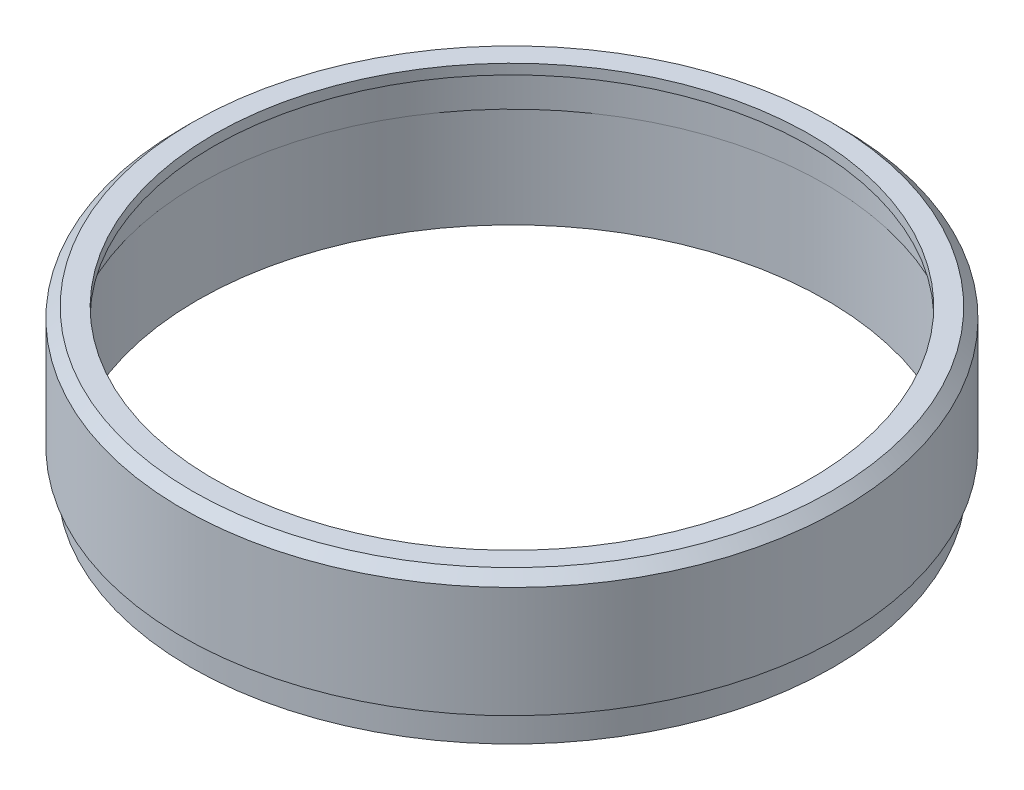
ISO-10303-21;
HEADER;
FILE_DESCRIPTION(('STEP AP214'),'2;1');
FILE_NAME('part.step','',(''),(''),'','','');
FILE_SCHEMA(('AUTOMOTIVE_DESIGN { 1 0 10303 214 1 1 1 1 }'));
ENDSEC;
DATA;
#1=APPLICATION_CONTEXT('core data for automotive mechanical design processes');
#2=APPLICATION_PROTOCOL_DEFINITION('international standard','automotive_design',2000,#1);
#3=PRODUCT_CONTEXT('',#1,'mechanical');
#4=PRODUCT('Part','Part','',(#3));
#5=PRODUCT_RELATED_PRODUCT_CATEGORY('part','',(#4));
#6=PRODUCT_DEFINITION_FORMATION('','',#4);
#7=PRODUCT_DEFINITION_CONTEXT('part definition',#1,'design');
#8=PRODUCT_DEFINITION('design','',#6,#7);
#9=PRODUCT_DEFINITION_SHAPE('','',#8);
#10=(LENGTH_UNIT() NAMED_UNIT(*) SI_UNIT(.MILLI.,.METRE.));
#11=(NAMED_UNIT(*) PLANE_ANGLE_UNIT() SI_UNIT($,.RADIAN.));
#12=(NAMED_UNIT(*) SI_UNIT($,.STERADIAN.) SOLID_ANGLE_UNIT());
#13=UNCERTAINTY_MEASURE_WITH_UNIT(LENGTH_MEASURE(1.E-05),#10,'distance_accuracy_value','');
#14=(GEOMETRIC_REPRESENTATION_CONTEXT(3) GLOBAL_UNCERTAINTY_ASSIGNED_CONTEXT((#13)) GLOBAL_UNIT_ASSIGNED_CONTEXT((#10,
#11,#12)) REPRESENTATION_CONTEXT('',''));
#15=CARTESIAN_POINT('',(0.,0.,0.));
#16=DIRECTION('',(0.,0.,1.));
#17=DIRECTION('',(1.,0.,0.));
#18=AXIS2_PLACEMENT_3D('',#15,#16,#17);
#19=CARTESIAN_POINT('',(0.,0.,0.));
#20=DIRECTION('',(0.,1.,0.));
#21=DIRECTION('',(-1.,0.,0.));
#22=AXIS2_PLACEMENT_3D('',#19,#20,#21);
#23=CYLINDRICAL_SURFACE('',#22,32.65);
#24=CARTESIAN_POINT('',(0.,4.,0.));
#25=DIRECTION('',(0.,1.,0.));
#26=DIRECTION('',(-1.,0.,0.));
#27=AXIS2_PLACEMENT_3D('',#24,#25,#26);
#28=CIRCLE('',#27,32.65);
#29=CARTESIAN_POINT('',(-32.65,4.,0.));
#30=VERTEX_POINT('',#29);
#31=EDGE_CURVE('E10',#30,#30,#28,.T.);
#32=ORIENTED_EDGE('',*,*,#31,.T.);
#33=EDGE_LOOP('',(#32));
#34=FACE_BOUND('',#33,.T.);
#35=CARTESIAN_POINT('',(0.,15.,0.));
#36=DIRECTION('',(0.,1.,0.));
#37=DIRECTION('',(-1.,0.,0.));
#38=AXIS2_PLACEMENT_3D('',#35,#36,#37);
#39=CIRCLE('',#38,32.65);
#40=CARTESIAN_POINT('',(-32.65,15.,0.));
#41=VERTEX_POINT('',#40);
#42=EDGE_CURVE('E72',#41,#41,#39,.T.);
#43=ORIENTED_EDGE('',*,*,#42,.F.);
#44=EDGE_LOOP('',(#43));
#45=FACE_BOUND('',#44,.T.);
#46=ADVANCED_FACE('F35',(#34,#45),#23,.T.);
#47=CARTESIAN_POINT('',(-32.65,4.,0.));
#48=DIRECTION('',(0.,-1.,0.));
#49=DIRECTION('',(1.,0.,0.));
#50=AXIS2_PLACEMENT_3D('',#47,#48,#49);
#51=PLANE('',#50);
#52=CARTESIAN_POINT('',(0.,4.,0.));
#53=DIRECTION('',(0.,1.,0.));
#54=DIRECTION('',(-1.,0.,0.));
#55=AXIS2_PLACEMENT_3D('',#52,#53,#54);
#56=CIRCLE('',#55,31.85);
#57=CARTESIAN_POINT('',(-31.85,4.,0.));
#58=VERTEX_POINT('',#57);
#59=EDGE_CURVE('E41',#58,#58,#56,.T.);
#60=ORIENTED_EDGE('',*,*,#59,.T.);
#61=EDGE_LOOP('',(#60));
#62=FACE_BOUND('',#61,.T.);
#63=ORIENTED_EDGE('',*,*,#31,.F.);
#64=EDGE_LOOP('',(#63));
#65=FACE_BOUND('',#64,.T.);
#66=ADVANCED_FACE('F80',(#62,#65),#51,.T.);
#67=CARTESIAN_POINT('',(0.,0.,0.));
#68=DIRECTION('',(0.,1.,0.));
#69=DIRECTION('',(-1.,0.,0.));
#70=AXIS2_PLACEMENT_3D('',#67,#68,#69);
#71=CYLINDRICAL_SURFACE('',#70,31.85);
#72=CARTESIAN_POINT('',(0.,1.,0.));
#73=DIRECTION('',(0.,1.,0.));
#74=DIRECTION('',(-1.,0.,0.));
#75=AXIS2_PLACEMENT_3D('',#72,#73,#74);
#76=CIRCLE('',#75,31.85);
#77=CARTESIAN_POINT('',(-31.85,1.,0.));
#78=VERTEX_POINT('',#77);
#79=EDGE_CURVE('E45',#78,#78,#76,.T.);
#80=ORIENTED_EDGE('',*,*,#79,.T.);
#81=EDGE_LOOP('',(#80));
#82=FACE_BOUND('',#81,.T.);
#83=ORIENTED_EDGE('',*,*,#59,.F.);
#84=EDGE_LOOP('',(#83));
#85=FACE_BOUND('',#84,.T.);
#86=ADVANCED_FACE('F84',(#82,#85),#71,.T.);
#87=CARTESIAN_POINT('',(-31.85,1.,0.));
#88=DIRECTION('',(0.,-1.,0.));
#89=DIRECTION('',(1.,0.,0.));
#90=AXIS2_PLACEMENT_3D('',#87,#88,#89);
#91=PLANE('',#90);
#92=CARTESIAN_POINT('',(0.,1.,0.));
#93=DIRECTION('',(0.,1.,0.));
#94=DIRECTION('',(-1.,0.,0.));
#95=AXIS2_PLACEMENT_3D('',#92,#93,#94);
#96=CIRCLE('',#95,31.15);
#97=CARTESIAN_POINT('',(-31.15,1.,0.));
#98=VERTEX_POINT('',#97);
#99=EDGE_CURVE('E49',#98,#98,#96,.T.);
#100=ORIENTED_EDGE('',*,*,#99,.T.);
#101=EDGE_LOOP('',(#100));
#102=FACE_BOUND('',#101,.T.);
#103=ORIENTED_EDGE('',*,*,#79,.F.);
#104=EDGE_LOOP('',(#103));
#105=FACE_BOUND('',#104,.T.);
#106=ADVANCED_FACE('F88',(#102,#105),#91,.T.);
#107=CARTESIAN_POINT('',(0.,0.,0.));
#108=DIRECTION('',(0.,1.,0.));
#109=DIRECTION('',(-1.,0.,0.));
#110=AXIS2_PLACEMENT_3D('',#107,#108,#109);
#111=CYLINDRICAL_SURFACE('',#110,31.15);
#112=CARTESIAN_POINT('',(0.,11.,0.));
#113=DIRECTION('',(0.,1.,0.));
#114=DIRECTION('',(-1.,0.,0.));
#115=AXIS2_PLACEMENT_3D('',#112,#113,#114);
#116=CIRCLE('',#115,31.15);
#117=CARTESIAN_POINT('',(-31.15,11.,0.));
#118=VERTEX_POINT('',#117);
#119=EDGE_CURVE('E54',#118,#118,#116,.T.);
#120=ORIENTED_EDGE('',*,*,#119,.T.);
#121=EDGE_LOOP('',(#120));
#122=FACE_BOUND('',#121,.T.);
#123=ORIENTED_EDGE('',*,*,#99,.F.);
#124=EDGE_LOOP('',(#123));
#125=FACE_BOUND('',#124,.T.);
#126=ADVANCED_FACE('F95',(#122,#125),#111,.F.);
#127=CARTESIAN_POINT('',(-31.15,11.,0.));
#128=DIRECTION('',(0.,-1.,0.));
#129=DIRECTION('',(1.,0.,0.));
#130=AXIS2_PLACEMENT_3D('',#127,#128,#129);
#131=PLANE('',#130);
#132=CARTESIAN_POINT('',(0.,11.,0.));
#133=DIRECTION('',(0.,1.,0.));
#134=DIRECTION('',(-1.,0.,0.));
#135=AXIS2_PLACEMENT_3D('',#132,#133,#134);
#136=CIRCLE('',#135,31.05);
#137=CARTESIAN_POINT('',(-31.05,11.,0.));
#138=VERTEX_POINT('',#137);
#139=EDGE_CURVE('E57',#138,#138,#136,.T.);
#140=ORIENTED_EDGE('',*,*,#139,.T.);
#141=EDGE_LOOP('',(#140));
#142=FACE_BOUND('',#141,.T.);
#143=ORIENTED_EDGE('',*,*,#119,.F.);
#144=EDGE_LOOP('',(#143));
#145=FACE_BOUND('',#144,.T.);
#146=ADVANCED_FACE('F99',(#142,#145),#131,.T.);
#147=CARTESIAN_POINT('',(0.,0.,0.));
#148=DIRECTION('',(0.,1.,0.));
#149=DIRECTION('',(-1.,0.,0.));
#150=AXIS2_PLACEMENT_3D('',#147,#148,#149);
#151=CYLINDRICAL_SURFACE('',#150,31.05);
#152=CARTESIAN_POINT('',(0.,15.,0.));
#153=DIRECTION('',(0.,1.,0.));
#154=DIRECTION('',(-1.,0.,0.));
#155=AXIS2_PLACEMENT_3D('',#152,#153,#154);
#156=CIRCLE('',#155,31.05);
#157=CARTESIAN_POINT('',(-31.05,15.,0.));
#158=VERTEX_POINT('',#157);
#159=EDGE_CURVE('E60',#158,#158,#156,.T.);
#160=ORIENTED_EDGE('',*,*,#159,.T.);
#161=EDGE_LOOP('',(#160));
#162=FACE_BOUND('',#161,.T.);
#163=ORIENTED_EDGE('',*,*,#139,.F.);
#164=EDGE_LOOP('',(#163));
#165=FACE_BOUND('',#164,.T.);
#166=ADVANCED_FACE('F103',(#162,#165),#151,.F.);
#167=CARTESIAN_POINT('',(-31.05,15.,0.));
#168=DIRECTION('',(0.,-1.,0.));
#169=DIRECTION('',(1.,0.,0.));
#170=AXIS2_PLACEMENT_3D('',#167,#168,#169);
#171=PLANE('',#170);
#172=CARTESIAN_POINT('',(0.,15.,0.));
#173=DIRECTION('',(0.,1.,0.));
#174=DIRECTION('',(-1.,0.,0.));
#175=AXIS2_PLACEMENT_3D('',#172,#173,#174);
#176=CIRCLE('',#175,29.55);
#177=CARTESIAN_POINT('',(-29.55,15.,0.));
#178=VERTEX_POINT('',#177);
#179=EDGE_CURVE('E63',#178,#178,#176,.T.);
#180=ORIENTED_EDGE('',*,*,#179,.T.);
#181=EDGE_LOOP('',(#180));
#182=FACE_BOUND('',#181,.T.);
#183=ORIENTED_EDGE('',*,*,#159,.F.);
#184=EDGE_LOOP('',(#183));
#185=FACE_BOUND('',#184,.T.);
#186=ADVANCED_FACE('F107',(#182,#185),#171,.T.);
#187=CARTESIAN_POINT('',(0.,0.,0.));
#188=DIRECTION('',(0.,1.,0.));
#189=DIRECTION('',(-1.,0.,0.));
#190=AXIS2_PLACEMENT_3D('',#187,#188,#189);
#191=CYLINDRICAL_SURFACE('',#190,29.55);
#192=CARTESIAN_POINT('',(0.,16.,0.));
#193=DIRECTION('',(0.,1.,0.));
#194=DIRECTION('',(-1.,0.,0.));
#195=AXIS2_PLACEMENT_3D('',#192,#193,#194);
#196=CIRCLE('',#195,29.55);
#197=CARTESIAN_POINT('',(-29.55,16.,0.));
#198=VERTEX_POINT('',#197);
#199=EDGE_CURVE('E66',#198,#198,#196,.T.);
#200=ORIENTED_EDGE('',*,*,#199,.T.);
#201=EDGE_LOOP('',(#200));
#202=FACE_BOUND('',#201,.T.);
#203=ORIENTED_EDGE('',*,*,#179,.F.);
#204=EDGE_LOOP('',(#203));
#205=FACE_BOUND('',#204,.T.);
#206=ADVANCED_FACE('F111',(#202,#205),#191,.F.);
#207=CARTESIAN_POINT('',(-29.55,16.,0.));
#208=DIRECTION('',(0.,1.,0.));
#209=DIRECTION('',(-1.,0.,0.));
#210=AXIS2_PLACEMENT_3D('',#207,#208,#209);
#211=PLANE('',#210);
#212=CARTESIAN_POINT('',(0.,16.,0.));
#213=DIRECTION('',(0.,1.,0.));
#214=DIRECTION('',(-1.,0.,0.));
#215=AXIS2_PLACEMENT_3D('',#212,#213,#214);
#216=CIRCLE('',#215,31.65);
#217=CARTESIAN_POINT('',(-31.65,16.,0.));
#218=VERTEX_POINT('',#217);
#219=EDGE_CURVE('E69',#218,#218,#216,.T.);
#220=ORIENTED_EDGE('',*,*,#219,.T.);
#221=EDGE_LOOP('',(#220));
#222=FACE_BOUND('',#221,.T.);
#223=ORIENTED_EDGE('',*,*,#199,.F.);
#224=EDGE_LOOP('',(#223));
#225=FACE_BOUND('',#224,.T.);
#226=ADVANCED_FACE('F115',(#222,#225),#211,.T.);
#227=CARTESIAN_POINT('',(0.,16.,0.));
#228=DIRECTION('',(0.,-1.,0.));
#229=DIRECTION('',(1.,0.,0.));
#230=AXIS2_PLACEMENT_3D('',#227,#228,#229);
#231=CONICAL_SURFACE('',#230,31.65,0.785398163397445);
#232=ORIENTED_EDGE('',*,*,#42,.T.);
#233=EDGE_LOOP('',(#232));
#234=FACE_BOUND('',#233,.T.);
#235=ORIENTED_EDGE('',*,*,#219,.F.);
#236=EDGE_LOOP('',(#235));
#237=FACE_BOUND('',#236,.T.);
#238=ADVANCED_FACE('F76',(#234,#237),#231,.T.);
#239=CLOSED_SHELL('',(#46,#66,#86,#106,#126,#146,#166,#186,#206,#226,#238));
#240=MANIFOLD_SOLID_BREP('B2',#239);
#241=ADVANCED_BREP_SHAPE_REPRESENTATION('',(#18,#240),#14);
#242=SHAPE_DEFINITION_REPRESENTATION(#9,#241);
ENDSEC;
END-ISO-10303-21;
